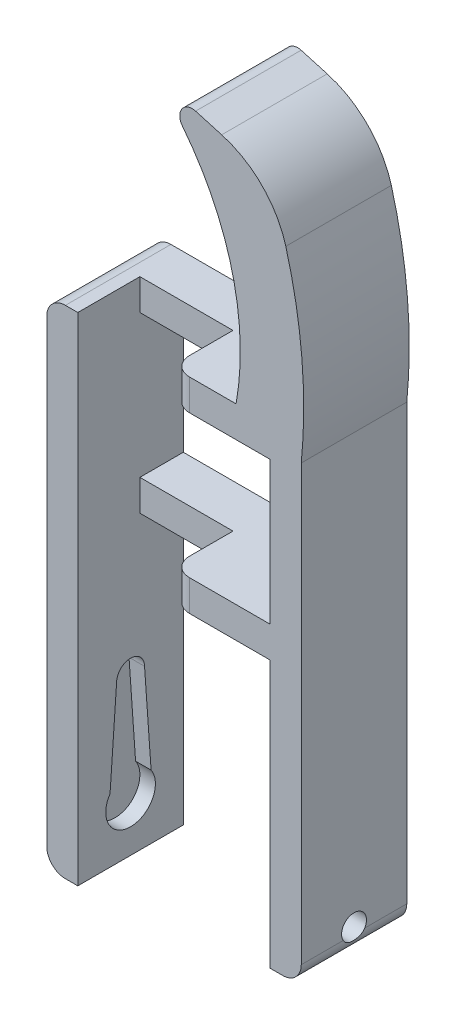
ISO-10303-21;
HEADER;
FILE_DESCRIPTION(('STEP AP214'),'2;1');
FILE_NAME('part.step','',(''),(''),'','','');
FILE_SCHEMA(('AUTOMOTIVE_DESIGN { 1 0 10303 214 1 1 1 1 }'));
ENDSEC;
DATA;
#1=APPLICATION_CONTEXT('core data for automotive mechanical design processes');
#2=APPLICATION_PROTOCOL_DEFINITION('international standard','automotive_design',2000,#1);
#3=PRODUCT_CONTEXT('',#1,'mechanical');
#4=PRODUCT('Part','Part','',(#3));
#5=PRODUCT_RELATED_PRODUCT_CATEGORY('part','',(#4));
#6=PRODUCT_DEFINITION_FORMATION('','',#4);
#7=PRODUCT_DEFINITION_CONTEXT('part definition',#1,'design');
#8=PRODUCT_DEFINITION('design','',#6,#7);
#9=PRODUCT_DEFINITION_SHAPE('','',#8);
#10=(LENGTH_UNIT() NAMED_UNIT(*) SI_UNIT(.MILLI.,.METRE.));
#11=(NAMED_UNIT(*) PLANE_ANGLE_UNIT() SI_UNIT($,.RADIAN.));
#12=(NAMED_UNIT(*) SI_UNIT($,.STERADIAN.) SOLID_ANGLE_UNIT());
#13=UNCERTAINTY_MEASURE_WITH_UNIT(LENGTH_MEASURE(1.E-05),#10,'distance_accuracy_value','');
#14=(GEOMETRIC_REPRESENTATION_CONTEXT(3) GLOBAL_UNCERTAINTY_ASSIGNED_CONTEXT((#13)) GLOBAL_UNIT_ASSIGNED_CONTEXT((#10,
#11,#12)) REPRESENTATION_CONTEXT('',''));
#15=CARTESIAN_POINT('',(0.,0.,0.));
#16=DIRECTION('',(0.,0.,1.));
#17=DIRECTION('',(1.,0.,0.));
#18=AXIS2_PLACEMENT_3D('',#15,#16,#17);
#19=CARTESIAN_POINT('',(36.,80.,0.));
#20=DIRECTION('',(1.,0.,0.));
#21=DIRECTION('',(0.,0.,-1.));
#22=AXIS2_PLACEMENT_3D('',#19,#20,#21);
#23=PLANE('',#22);
#24=CARTESIAN_POINT('',(36.,8.,8.5));
#25=DIRECTION('',(1.,0.,0.));
#26=DIRECTION('',(0.,0.,-1.));
#27=AXIS2_PLACEMENT_3D('',#24,#25,#26);
#28=CIRCLE('',#27,2.);
#29=CARTESIAN_POINT('',(36.,8.,6.5));
#30=VERTEX_POINT('',#29);
#31=EDGE_CURVE('E509',#30,#30,#28,.F.);
#32=ORIENTED_EDGE('',*,*,#31,.F.);
#33=EDGE_LOOP('',(#32));
#34=FACE_BOUND('',#33,.T.);
#35=DIRECTION('',(0.,-1.,0.));
#36=VECTOR('',#35,1.);
#37=CARTESIAN_POINT('',(36.,80.,17.));
#38=LINE('',#37,#36);
#39=CARTESIAN_POINT('',(36.,47.,17.));
#40=VERTEX_POINT('',#39);
#41=CARTESIAN_POINT('',(36.,4.,17.));
#42=VERTEX_POINT('',#41);
#43=EDGE_CURVE('E531',#40,#42,#38,.T.);
#44=ORIENTED_EDGE('',*,*,#43,.F.);
#45=DIRECTION('',(0.,0.,-1.));
#46=VECTOR('',#45,1.);
#47=CARTESIAN_POINT('',(36.,47.,7.));
#48=LINE('',#47,#46);
#49=CARTESIAN_POINT('',(36.,47.,0.));
#50=VERTEX_POINT('',#49);
#51=EDGE_CURVE('E495',#40,#50,#48,.T.);
#52=ORIENTED_EDGE('',*,*,#51,.T.);
#53=DIRECTION('',(0.,-1.,0.));
#54=VECTOR('',#53,1.);
#55=CARTESIAN_POINT('',(36.,80.,0.));
#56=LINE('',#55,#54);
#57=CARTESIAN_POINT('',(36.,4.,0.));
#58=VERTEX_POINT('',#57);
#59=EDGE_CURVE('E522',#50,#58,#56,.T.);
#60=ORIENTED_EDGE('',*,*,#59,.T.);
#61=DIRECTION('',(0.,0.,-1.));
#62=VECTOR('',#61,1.);
#63=CARTESIAN_POINT('',(36.,4.,17.));
#64=LINE('',#63,#62);
#65=EDGE_CURVE('E512',#42,#58,#64,.T.);
#66=ORIENTED_EDGE('',*,*,#65,.F.);
#67=EDGE_LOOP('',(#44,#52,#60,#66));
#68=FACE_BOUND('',#67,.T.);
#69=ADVANCED_FACE('F37',(#34,#68),#23,.F.);
#70=DIRECTION('',(0.,0.,1.));
#71=VECTOR('',#70,1.);
#72=CARTESIAN_POINT('',(36.,52.,7.));
#73=LINE('',#72,#71);
#74=CARTESIAN_POINT('',(36.,52.,0.));
#75=VERTEX_POINT('',#74);
#76=CARTESIAN_POINT('',(36.,52.,17.));
#77=VERTEX_POINT('',#76);
#78=EDGE_CURVE('E502',#75,#77,#73,.T.);
#79=ORIENTED_EDGE('',*,*,#78,.T.);
#80=CARTESIAN_POINT('',(36.,75.,17.));
#81=VERTEX_POINT('',#80);
#82=EDGE_CURVE('E532',#81,#77,#38,.T.);
#83=ORIENTED_EDGE('',*,*,#82,.F.);
#84=DIRECTION('',(0.,0.,-1.));
#85=VECTOR('',#84,1.);
#86=CARTESIAN_POINT('',(36.,75.,7.));
#87=LINE('',#86,#85);
#88=CARTESIAN_POINT('',(36.,75.,0.));
#89=VERTEX_POINT('',#88);
#90=EDGE_CURVE('E544',#81,#89,#87,.T.);
#91=ORIENTED_EDGE('',*,*,#90,.T.);
#92=EDGE_CURVE('E523',#89,#75,#56,.T.);
#93=ORIENTED_EDGE('',*,*,#92,.T.);
#94=EDGE_LOOP('',(#79,#83,#91,#93));
#95=FACE_BOUND('',#94,.T.);
#96=ADVANCED_FACE('F387',(#95),#23,.F.);
#97=CARTESIAN_POINT('',(41.002,52.,7.));
#98=DIRECTION('',(0.,0.,-1.));
#99=DIRECTION('',(-1.,0.,0.));
#100=AXIS2_PLACEMENT_3D('',#97,#98,#99);
#101=PLANE('',#100);
#102=DIRECTION('',(0.,-1.,0.));
#103=VECTOR('',#102,1.);
#104=CARTESIAN_POINT('',(20.,47.,6.99999999999996));
#105=LINE('',#104,#103);
#106=CARTESIAN_POINT('',(20.,52.,6.99999999999996));
#107=VERTEX_POINT('',#106);
#108=CARTESIAN_POINT('',(20.,47.,7.));
#109=VERTEX_POINT('',#108);
#110=EDGE_CURVE('E266',#107,#109,#105,.T.);
#111=ORIENTED_EDGE('',*,*,#110,.F.);
#112=DIRECTION('',(-1.,0.,0.));
#113=VECTOR('',#112,1.);
#114=CARTESIAN_POINT('',(41.002,52.,7.));
#115=LINE('',#114,#113);
#116=CARTESIAN_POINT('',(5.,52.,7.));
#117=VERTEX_POINT('',#116);
#118=EDGE_CURVE('E492',#107,#117,#115,.T.);
#119=ORIENTED_EDGE('',*,*,#118,.T.);
#120=DIRECTION('',(0.,-1.,0.));
#121=VECTOR('',#120,1.);
#122=CARTESIAN_POINT('',(5.,52.,7.));
#123=LINE('',#122,#121);
#124=CARTESIAN_POINT('',(5.,47.,7.));
#125=VERTEX_POINT('',#124);
#126=EDGE_CURVE('E484',#117,#125,#123,.T.);
#127=ORIENTED_EDGE('',*,*,#126,.T.);
#128=DIRECTION('',(-1.,0.,0.));
#129=VECTOR('',#128,1.);
#130=CARTESIAN_POINT('',(41.002,47.,7.));
#131=LINE('',#130,#129);
#132=EDGE_CURVE('E493',#109,#125,#131,.T.);
#133=ORIENTED_EDGE('',*,*,#132,.F.);
#134=EDGE_LOOP('',(#111,#119,#127,#133));
#135=FACE_BOUND('',#134,.T.);
#136=ADVANCED_FACE('F372',(#135),#101,.F.);
#137=CARTESIAN_POINT('',(41.002,80.,7.));
#138=DIRECTION('',(0.,0.,-1.));
#139=DIRECTION('',(0.,1.,0.));
#140=AXIS2_PLACEMENT_3D('',#137,#138,#139);
#141=PLANE('',#140);
#142=DIRECTION('',(0.,-1.,0.));
#143=VECTOR('',#142,1.);
#144=CARTESIAN_POINT('',(20.,80.,6.99999999999996));
#145=LINE('',#144,#143);
#146=CARTESIAN_POINT('',(20.,80.,6.99999999999996));
#147=VERTEX_POINT('',#146);
#148=CARTESIAN_POINT('',(20.,75.,6.99999999999996));
#149=VERTEX_POINT('',#148);
#150=EDGE_CURVE('E477',#147,#149,#145,.T.);
#151=ORIENTED_EDGE('',*,*,#150,.F.);
#152=DIRECTION('',(-1.,0.,0.));
#153=VECTOR('',#152,1.);
#154=CARTESIAN_POINT('',(41.002,80.,7.));
#155=LINE('',#154,#153);
#156=CARTESIAN_POINT('',(5.,80.,7.));
#157=VERTEX_POINT('',#156);
#158=EDGE_CURVE('E539',#147,#157,#155,.T.);
#159=ORIENTED_EDGE('',*,*,#158,.T.);
#160=DIRECTION('',(0.,-1.,0.));
#161=VECTOR('',#160,1.);
#162=CARTESIAN_POINT('',(5.,80.,7.));
#163=LINE('',#162,#161);
#164=CARTESIAN_POINT('',(5.,75.,7.));
#165=VERTEX_POINT('',#164);
#166=EDGE_CURVE('E535',#157,#165,#163,.T.);
#167=ORIENTED_EDGE('',*,*,#166,.T.);
#168=DIRECTION('',(-1.,0.,0.));
#169=VECTOR('',#168,1.);
#170=CARTESIAN_POINT('',(41.002,75.,7.));
#171=LINE('',#170,#169);
#172=EDGE_CURVE('E542',#149,#165,#171,.T.);
#173=ORIENTED_EDGE('',*,*,#172,.F.);
#174=EDGE_LOOP('',(#151,#159,#167,#173));
#175=FACE_BOUND('',#174,.T.);
#176=ADVANCED_FACE('F393',(#175),#141,.F.);
#177=CARTESIAN_POINT('',(5.,80.,0.));
#178=DIRECTION('',(-1.,0.,0.));
#179=DIRECTION('',(0.,0.,1.));
#180=AXIS2_PLACEMENT_3D('',#177,#178,#179);
#181=PLANE('',#180);
#182=CARTESIAN_POINT('',(5.,25.2677997154365,8.5));
#183=DIRECTION('',(1.,0.,0.));
#184=DIRECTION('',(0.,0.,-1.));
#185=AXIS2_PLACEMENT_3D('',#182,#183,#184);
#186=CIRCLE('',#185,2.25);
#187=CARTESIAN_POINT('',(5.,25.2677997154365,10.75));
#188=VERTEX_POINT('',#187);
#189=CARTESIAN_POINT('',(5.,25.2677997154365,6.25));
#190=VERTEX_POINT('',#189);
#191=EDGE_CURVE('E551',#188,#190,#186,.F.);
#192=ORIENTED_EDGE('',*,*,#191,.T.);
#193=DIRECTION('',(0.,0.997531391051944,0.0702219614221419));
#194=VECTOR('',#193,1.);
#195=CARTESIAN_POINT('',(5.,-0.313205167656498,4.44920620628706));
#196=LINE('',#195,#194);
#197=CARTESIAN_POINT('',(5.,10.25,5.19281086116926));
#198=VERTEX_POINT('',#197);
#199=EDGE_CURVE('E555',#198,#190,#196,.T.);
#200=ORIENTED_EDGE('',*,*,#199,.F.);
#201=CARTESIAN_POINT('',(5.,8.,8.5));
#202=DIRECTION('',(1.,0.,0.));
#203=DIRECTION('',(0.,0.,-1.));
#204=AXIS2_PLACEMENT_3D('',#201,#202,#203);
#205=CIRCLE('',#204,4.);
#206=CARTESIAN_POINT('',(5.,10.25,11.8071891388307));
#207=VERTEX_POINT('',#206);
#208=EDGE_CURVE('E569',#207,#198,#205,.T.);
#209=ORIENTED_EDGE('',*,*,#208,.F.);
#210=DIRECTION('',(0.,0.997531391051944,-0.0702219614221418));
#211=VECTOR('',#210,1.);
#212=CARTESIAN_POINT('',(5.,0.877621216960529,12.4669646879914));
#213=LINE('',#212,#211);
#214=EDGE_CURVE('E566',#207,#188,#213,.T.);
#215=ORIENTED_EDGE('',*,*,#214,.T.);
#216=EDGE_LOOP('',(#192,#200,#209,#215));
#217=FACE_BOUND('',#216,.T.);
#218=DIRECTION('',(0.,0.,-1.));
#219=VECTOR('',#218,1.);
#220=CARTESIAN_POINT('',(5.,47.,7.));
#221=LINE('',#220,#219);
#222=CARTESIAN_POINT('',(5.,47.,0.));
#223=VERTEX_POINT('',#222);
#224=EDGE_CURVE('E485',#125,#223,#221,.T.);
#225=ORIENTED_EDGE('',*,*,#224,.F.);
#226=ORIENTED_EDGE('',*,*,#126,.F.);
#227=DIRECTION('',(0.,0.,1.));
#228=VECTOR('',#227,1.);
#229=CARTESIAN_POINT('',(5.,52.,7.));
#230=LINE('',#229,#228);
#231=CARTESIAN_POINT('',(5.,52.,0.));
#232=VERTEX_POINT('',#231);
#233=EDGE_CURVE('E487',#232,#117,#230,.T.);
#234=ORIENTED_EDGE('',*,*,#233,.F.);
#235=DIRECTION('',(0.,-1.,0.));
#236=VECTOR('',#235,1.);
#237=CARTESIAN_POINT('',(5.,80.,0.));
#238=LINE('',#237,#236);
#239=CARTESIAN_POINT('',(5.,75.,0.));
#240=VERTEX_POINT('',#239);
#241=EDGE_CURVE('E294',#240,#232,#238,.T.);
#242=ORIENTED_EDGE('',*,*,#241,.F.);
#243=DIRECTION('',(0.,0.,-1.));
#244=VECTOR('',#243,1.);
#245=CARTESIAN_POINT('',(5.,75.,7.));
#246=LINE('',#245,#244);
#247=EDGE_CURVE('E536',#165,#240,#246,.T.);
#248=ORIENTED_EDGE('',*,*,#247,.F.);
#249=ORIENTED_EDGE('',*,*,#166,.F.);
#250=DIRECTION('',(0.,0.,-1.));
#251=VECTOR('',#250,1.);
#252=CARTESIAN_POINT('',(5.,80.,0.));
#253=LINE('',#252,#251);
#254=CARTESIAN_POINT('',(5.,80.,17.));
#255=VERTEX_POINT('',#254);
#256=EDGE_CURVE('E275',#255,#157,#253,.T.);
#257=ORIENTED_EDGE('',*,*,#256,.F.);
#258=DIRECTION('',(0.,-1.,0.));
#259=VECTOR('',#258,1.);
#260=CARTESIAN_POINT('',(5.,80.,17.));
#261=LINE('',#260,#259);
#262=CARTESIAN_POINT('',(5.,0.,17.));
#263=VERTEX_POINT('',#262);
#264=EDGE_CURVE('E297',#255,#263,#261,.T.);
#265=ORIENTED_EDGE('',*,*,#264,.T.);
#266=DIRECTION('',(0.,0.,-1.));
#267=VECTOR('',#266,1.);
#268=CARTESIAN_POINT('',(5.,0.,0.));
#269=LINE('',#268,#267);
#270=CARTESIAN_POINT('',(5.,0.,0.));
#271=VERTEX_POINT('',#270);
#272=EDGE_CURVE('E287',#263,#271,#269,.T.);
#273=ORIENTED_EDGE('',*,*,#272,.T.);
#274=EDGE_CURVE('E278',#223,#271,#238,.T.);
#275=ORIENTED_EDGE('',*,*,#274,.F.);
#276=EDGE_LOOP('',(#225,#226,#234,#242,#248,#249,#257,#265,#273,#275));
#277=FACE_BOUND('',#276,.T.);
#278=ADVANCED_FACE('F396',(#217,#277),#181,.F.);
#279=CARTESIAN_POINT('',(0.,80.,0.));
#280=DIRECTION('',(1.,0.,0.));
#281=DIRECTION('',(0.,0.,-1.));
#282=AXIS2_PLACEMENT_3D('',#279,#280,#281);
#283=PLANE('',#282);
#284=DIRECTION('',(0.,-1.,0.));
#285=VECTOR('',#284,1.);
#286=CARTESIAN_POINT('',(0.,80.,17.));
#287=LINE('',#286,#285);
#288=CARTESIAN_POINT('',(0.,77.,17.));
#289=VERTEX_POINT('',#288);
#290=CARTESIAN_POINT('',(0.,3.,17.));
#291=VERTEX_POINT('',#290);
#292=EDGE_CURVE('E300',#289,#291,#287,.T.);
#293=ORIENTED_EDGE('',*,*,#292,.F.);
#294=DIRECTION('',(0.,0.,1.));
#295=VECTOR('',#294,1.);
#296=CARTESIAN_POINT('',(0.,77.,0.));
#297=LINE('',#296,#295);
#298=CARTESIAN_POINT('',(0.,77.,0.));
#299=VERTEX_POINT('',#298);
#300=EDGE_CURVE('E332',#289,#299,#297,.F.);
#301=ORIENTED_EDGE('',*,*,#300,.T.);
#302=DIRECTION('',(0.,-1.,0.));
#303=VECTOR('',#302,1.);
#304=CARTESIAN_POINT('',(0.,80.,0.));
#305=LINE('',#304,#303);
#306=CARTESIAN_POINT('',(0.,3.,0.));
#307=VERTEX_POINT('',#306);
#308=EDGE_CURVE('E274',#299,#307,#305,.T.);
#309=ORIENTED_EDGE('',*,*,#308,.T.);
#310=DIRECTION('',(0.,0.,1.));
#311=VECTOR('',#310,1.);
#312=CARTESIAN_POINT('',(0.,3.,0.));
#313=LINE('',#312,#311);
#314=EDGE_CURVE('E329',#307,#291,#313,.T.);
#315=ORIENTED_EDGE('',*,*,#314,.T.);
#316=EDGE_LOOP('',(#293,#301,#309,#315));
#317=FACE_BOUND('',#316,.T.);
#318=ADVANCED_FACE('F429',(#317),#283,.F.);
#319=CARTESIAN_POINT('',(0.,80.,17.));
#320=DIRECTION('',(0.,0.,-1.));
#321=DIRECTION('',(-1.,0.,0.));
#322=AXIS2_PLACEMENT_3D('',#319,#320,#321);
#323=PLANE('',#322);
#324=DIRECTION('',(1.,0.,0.));
#325=VECTOR('',#324,1.);
#326=CARTESIAN_POINT('',(0.,80.,17.));
#327=LINE('',#326,#325);
#328=CARTESIAN_POINT('',(3.,80.,17.));
#329=VERTEX_POINT('',#328);
#330=EDGE_CURVE('E281',#329,#255,#327,.T.);
#331=ORIENTED_EDGE('',*,*,#330,.F.);
#332=CARTESIAN_POINT('',(3.,77.,17.));
#333=DIRECTION('',(0.,0.,-1.));
#334=DIRECTION('',(-1.,0.,0.));
#335=AXIS2_PLACEMENT_3D('',#332,#333,#334);
#336=CIRCLE('',#335,3.);
#337=EDGE_CURVE('E327',#329,#289,#336,.F.);
#338=ORIENTED_EDGE('',*,*,#337,.T.);
#339=ORIENTED_EDGE('',*,*,#292,.T.);
#340=CARTESIAN_POINT('',(3.,3.,17.));
#341=DIRECTION('',(0.,0.,-1.));
#342=DIRECTION('',(-1.,0.,0.));
#343=AXIS2_PLACEMENT_3D('',#340,#341,#342);
#344=CIRCLE('',#343,3.);
#345=CARTESIAN_POINT('',(3.,0.,17.));
#346=VERTEX_POINT('',#345);
#347=EDGE_CURVE('E325',#291,#346,#344,.F.);
#348=ORIENTED_EDGE('',*,*,#347,.T.);
#349=DIRECTION('',(1.,0.,0.));
#350=VECTOR('',#349,1.);
#351=CARTESIAN_POINT('',(0.,0.,17.));
#352=LINE('',#351,#350);
#353=EDGE_CURVE('E285',#346,#263,#352,.T.);
#354=ORIENTED_EDGE('',*,*,#353,.T.);
#355=ORIENTED_EDGE('',*,*,#264,.F.);
#356=EDGE_LOOP('',(#331,#338,#339,#348,#354,#355));
#357=FACE_BOUND('',#356,.T.);
#358=ADVANCED_FACE('F425',(#357),#323,.F.);
#359=CARTESIAN_POINT('',(0.,80.,0.));
#360=DIRECTION('',(0.,0.,1.));
#361=DIRECTION('',(1.,0.,0.));
#362=AXIS2_PLACEMENT_3D('',#359,#360,#361);
#363=PLANE('',#362);
#364=ORIENTED_EDGE('',*,*,#241,.T.);
#365=DIRECTION('',(-1.,0.,0.));
#366=VECTOR('',#365,1.);
#367=CARTESIAN_POINT('',(41.002,52.,0.));
#368=LINE('',#367,#366);
#369=EDGE_CURVE('E499',#75,#232,#368,.T.);
#370=ORIENTED_EDGE('',*,*,#369,.F.);
#371=ORIENTED_EDGE('',*,*,#92,.F.);
#372=DIRECTION('',(-1.,0.,0.));
#373=VECTOR('',#372,1.);
#374=CARTESIAN_POINT('',(41.002,75.,0.));
#375=LINE('',#374,#373);
#376=EDGE_CURVE('E545',#89,#240,#375,.T.);
#377=ORIENTED_EDGE('',*,*,#376,.T.);
#378=EDGE_LOOP('',(#364,#370,#371,#377));
#379=FACE_BOUND('',#378,.T.);
#380=DIRECTION('',(-0.961523947640823,0.274721127897379,0.));
#381=VECTOR('',#380,1.);
#382=CARTESIAN_POINT('',(17.0712082897131,119.558177774716,0.));
#383=LINE('',#382,#381);
#384=CARTESIAN_POINT('',(28.1803762196112,116.384129794745,0.));
#385=VERTEX_POINT('',#384);
#386=CARTESIAN_POINT('',(23.9787472792206,117.584595206285,0.));
#387=VERTEX_POINT('',#386);
#388=EDGE_CURVE('E267',#385,#387,#383,.T.);
#389=ORIENTED_EDGE('',*,*,#388,.F.);
#390=CARTESIAN_POINT('',(24.0595593011505,101.961270580133,0.));
#391=DIRECTION('',(0.,0.,1.));
#392=DIRECTION('',(1.,0.,0.));
#393=AXIS2_PLACEMENT_3D('',#390,#391,#392);
#394=CIRCLE('',#393,15.);
#395=CARTESIAN_POINT('',(38.5085143162054,105.989632402626,0.));
#396=VERTEX_POINT('',#395);
#397=EDGE_CURVE('E11',#385,#396,#394,.F.);
#398=ORIENTED_EDGE('',*,*,#397,.T.);
#399=CARTESIAN_POINT('',(-37.2055834888464,84.8805777544116,0.));
#400=DIRECTION('',(0.,0.,1.));
#401=DIRECTION('',(-1.,0.,0.));
#402=AXIS2_PLACEMENT_3D('',#399,#400,#401);
#403=CIRCLE('',#402,78.6016335362965);
#404=CARTESIAN_POINT('',(41.,77.,0.));
#405=VERTEX_POINT('',#404);
#406=EDGE_CURVE('E256',#405,#396,#403,.T.);
#407=ORIENTED_EDGE('',*,*,#406,.F.);
#408=DIRECTION('',(0.,-1.,0.));
#409=VECTOR('',#408,1.);
#410=CARTESIAN_POINT('',(41.,80.,0.));
#411=LINE('',#410,#409);
#412=CARTESIAN_POINT('',(41.,7.00000000000001,0.));
#413=VERTEX_POINT('',#412);
#414=EDGE_CURVE('E525',#405,#413,#411,.T.);
#415=ORIENTED_EDGE('',*,*,#414,.T.);
#416=CARTESIAN_POINT('',(38.,7.,0.));
#417=DIRECTION('',(0.,0.,1.));
#418=DIRECTION('',(1.,0.,0.));
#419=AXIS2_PLACEMENT_3D('',#416,#417,#418);
#420=CIRCLE('',#419,3.);
#421=CARTESIAN_POINT('',(38.,4.,0.));
#422=VERTEX_POINT('',#421);
#423=EDGE_CURVE('E309',#413,#422,#420,.F.);
#424=ORIENTED_EDGE('',*,*,#423,.T.);
#425=DIRECTION('',(1.,0.,0.));
#426=VECTOR('',#425,1.);
#427=CARTESIAN_POINT('',(-0.001000000000001,4.,0.));
#428=LINE('',#427,#426);
#429=EDGE_CURVE('E515',#58,#422,#428,.T.);
#430=ORIENTED_EDGE('',*,*,#429,.F.);
#431=ORIENTED_EDGE('',*,*,#59,.F.);
#432=DIRECTION('',(-1.,0.,0.));
#433=VECTOR('',#432,1.);
#434=CARTESIAN_POINT('',(41.002,47.,0.));
#435=LINE('',#434,#433);
#436=EDGE_CURVE('E496',#50,#223,#435,.T.);
#437=ORIENTED_EDGE('',*,*,#436,.T.);
#438=ORIENTED_EDGE('',*,*,#274,.T.);
#439=DIRECTION('',(-1.,0.,0.));
#440=VECTOR('',#439,1.);
#441=CARTESIAN_POINT('',(0.,0.,0.));
#442=LINE('',#441,#440);
#443=CARTESIAN_POINT('',(3.,0.,0.));
#444=VERTEX_POINT('',#443);
#445=EDGE_CURVE('E291',#271,#444,#442,.T.);
#446=ORIENTED_EDGE('',*,*,#445,.T.);
#447=CARTESIAN_POINT('',(3.,3.,0.));
#448=DIRECTION('',(0.,0.,1.));
#449=DIRECTION('',(1.,0.,0.));
#450=AXIS2_PLACEMENT_3D('',#447,#448,#449);
#451=CIRCLE('',#450,3.);
#452=EDGE_CURVE('E307',#444,#307,#451,.F.);
#453=ORIENTED_EDGE('',*,*,#452,.T.);
#454=ORIENTED_EDGE('',*,*,#308,.F.);
#455=CARTESIAN_POINT('',(3.,77.,0.));
#456=DIRECTION('',(0.,0.,1.));
#457=DIRECTION('',(1.,0.,0.));
#458=AXIS2_PLACEMENT_3D('',#455,#456,#457);
#459=CIRCLE('',#458,3.);
#460=CARTESIAN_POINT('',(3.,80.,0.));
#461=VERTEX_POINT('',#460);
#462=EDGE_CURVE('E272',#299,#461,#459,.F.);
#463=ORIENTED_EDGE('',*,*,#462,.T.);
#464=DIRECTION('',(-1.,0.,0.));
#465=VECTOR('',#464,1.);
#466=CARTESIAN_POINT('',(0.,80.,0.));
#467=LINE('',#466,#465);
#468=CARTESIAN_POINT('',(30.5,80.,0.));
#469=VERTEX_POINT('',#468);
#470=EDGE_CURVE('E262',#469,#461,#467,.T.);
#471=ORIENTED_EDGE('',*,*,#470,.F.);
#472=CARTESIAN_POINT('',(-12.0394476855244,87.6175792804137,0.));
#473=DIRECTION('',(0.,0.,-1.));
#474=DIRECTION('',(-1.,0.,0.));
#475=AXIS2_PLACEMENT_3D('',#472,#473,#474);
#476=CIRCLE('',#475,43.2161095366399);
#477=CARTESIAN_POINT('',(21.8604503354652,114.4211058702,0.));
#478=VERTEX_POINT('',#477);
#479=EDGE_CURVE('E244',#478,#469,#476,.T.);
#480=ORIENTED_EDGE('',*,*,#479,.F.);
#481=CARTESIAN_POINT('',(23.4293050234259,115.661547311004,0.));
#482=DIRECTION('',(0.,0.,1.));
#483=DIRECTION('',(1.,0.,0.));
#484=AXIS2_PLACEMENT_3D('',#481,#482,#483);
#485=CIRCLE('',#484,2.);
#486=EDGE_CURVE('E630',#478,#387,#485,.F.);
#487=ORIENTED_EDGE('',*,*,#486,.T.);
#488=EDGE_LOOP('',(#389,#398,#407,#415,#424,#430,#431,#437,#438,#446,#453,#454,#463,#471,#480,#487));
#489=FACE_BOUND('',#488,.T.);
#490=ADVANCED_FACE('F269',(#379,#489),#363,.F.);
#491=CARTESIAN_POINT('',(0.,80.,0.));
#492=DIRECTION('',(0.,1.,0.));
#493=DIRECTION('',(0.,0.,1.));
#494=AXIS2_PLACEMENT_3D('',#491,#492,#493);
#495=PLANE('',#494);
#496=DIRECTION('',(0.,0.,1.));
#497=VECTOR('',#496,1.);
#498=CARTESIAN_POINT('',(30.5,80.,0.));
#499=LINE('',#498,#497);
#500=CARTESIAN_POINT('',(30.5,80.,17.));
#501=VERTEX_POINT('',#500);
#502=EDGE_CURVE('E248',#469,#501,#499,.T.);
#503=ORIENTED_EDGE('',*,*,#502,.F.);
#504=ORIENTED_EDGE('',*,*,#470,.T.);
#505=DIRECTION('',(0.,0.,1.));
#506=VECTOR('',#505,1.);
#507=CARTESIAN_POINT('',(3.,80.,17.));
#508=LINE('',#507,#506);
#509=EDGE_CURVE('E305',#461,#329,#508,.T.);
#510=ORIENTED_EDGE('',*,*,#509,.T.);
#511=ORIENTED_EDGE('',*,*,#330,.T.);
#512=ORIENTED_EDGE('',*,*,#256,.T.);
#513=ORIENTED_EDGE('',*,*,#158,.F.);
#514=DIRECTION('',(0.,0.,-1.));
#515=VECTOR('',#514,1.);
#516=CARTESIAN_POINT('',(20.,80.,17.));
#517=LINE('',#516,#515);
#518=CARTESIAN_POINT('',(20.,80.,14.));
#519=VERTEX_POINT('',#518);
#520=EDGE_CURVE('E475',#519,#147,#517,.T.);
#521=ORIENTED_EDGE('',*,*,#520,.F.);
#522=CARTESIAN_POINT('',(23.,80.,14.));
#523=DIRECTION('',(0.,1.,0.));
#524=DIRECTION('',(0.,0.,1.));
#525=AXIS2_PLACEMENT_3D('',#522,#523,#524);
#526=CIRCLE('',#525,3.);
#527=CARTESIAN_POINT('',(23.,80.,17.));
#528=VERTEX_POINT('',#527);
#529=EDGE_CURVE('E303',#519,#528,#526,.T.);
#530=ORIENTED_EDGE('',*,*,#529,.T.);
#531=DIRECTION('',(1.,0.,0.));
#532=VECTOR('',#531,1.);
#533=CARTESIAN_POINT('',(36.,80.,17.));
#534=LINE('',#533,#532);
#535=EDGE_CURVE('E265',#528,#501,#534,.T.);
#536=ORIENTED_EDGE('',*,*,#535,.T.);
#537=EDGE_LOOP('',(#503,#504,#510,#511,#512,#513,#521,#530,#536));
#538=FACE_BOUND('',#537,.T.);
#539=ADVANCED_FACE('F260',(#538),#495,.T.);
#540=CARTESIAN_POINT('',(0.,0.,0.));
#541=DIRECTION('',(0.,1.,0.));
#542=DIRECTION('',(0.,0.,1.));
#543=AXIS2_PLACEMENT_3D('',#540,#541,#542);
#544=PLANE('',#543);
#545=ORIENTED_EDGE('',*,*,#353,.F.);
#546=DIRECTION('',(0.,0.,1.));
#547=VECTOR('',#546,1.);
#548=CARTESIAN_POINT('',(3.,0.,0.));
#549=LINE('',#548,#547);
#550=EDGE_CURVE('E357',#346,#444,#549,.F.);
#551=ORIENTED_EDGE('',*,*,#550,.T.);
#552=ORIENTED_EDGE('',*,*,#445,.F.);
#553=ORIENTED_EDGE('',*,*,#272,.F.);
#554=EDGE_LOOP('',(#545,#551,#552,#553));
#555=FACE_BOUND('',#554,.T.);
#556=ADVANCED_FACE('F416',(#555),#544,.F.);
#557=CARTESIAN_POINT('',(2.5,25.2677997154365,8.5));
#558=DIRECTION('',(1.,0.,0.));
#559=DIRECTION('',(0.,0.,-1.));
#560=AXIS2_PLACEMENT_3D('',#557,#558,#559);
#561=CYLINDRICAL_SURFACE('',#560,2.25);
#562=ORIENTED_EDGE('',*,*,#191,.F.);
#563=DIRECTION('',(1.,0.,0.));
#564=VECTOR('',#563,1.);
#565=CARTESIAN_POINT('',(2.5,25.2677997154365,10.75));
#566=LINE('',#565,#564);
#567=CARTESIAN_POINT('',(2.5,25.2677997154365,10.75));
#568=VERTEX_POINT('',#567);
#569=EDGE_CURVE('E563',#568,#188,#566,.T.);
#570=ORIENTED_EDGE('',*,*,#569,.F.);
#571=CARTESIAN_POINT('',(2.5,25.2677997154365,8.5));
#572=DIRECTION('',(1.,0.,0.));
#573=DIRECTION('',(0.,0.,-1.));
#574=AXIS2_PLACEMENT_3D('',#571,#572,#573);
#575=CIRCLE('',#574,2.25);
#576=CARTESIAN_POINT('',(2.5,25.2677997154365,6.25));
#577=VERTEX_POINT('',#576);
#578=EDGE_CURVE('E552',#568,#577,#575,.F.);
#579=ORIENTED_EDGE('',*,*,#578,.T.);
#580=DIRECTION('',(1.,0.,0.));
#581=VECTOR('',#580,1.);
#582=CARTESIAN_POINT('',(2.5,25.2677997154365,6.25));
#583=LINE('',#582,#581);
#584=EDGE_CURVE('E288',#577,#190,#583,.T.);
#585=ORIENTED_EDGE('',*,*,#584,.T.);
#586=EDGE_LOOP('',(#562,#570,#579,#585));
#587=FACE_BOUND('',#586,.T.);
#588=ADVANCED_FACE('F406',(#587),#561,.F.);
#589=CARTESIAN_POINT('',(2.5,-0.313205167656498,4.44920620628706));
#590=DIRECTION('',(0.,0.0702219614221419,-0.997531391051944));
#591=DIRECTION('',(0.,0.997531391051944,0.0702219614221419));
#592=AXIS2_PLACEMENT_3D('',#589,#590,#591);
#593=PLANE('',#592);
#594=ORIENTED_EDGE('',*,*,#199,.T.);
#595=ORIENTED_EDGE('',*,*,#584,.F.);
#596=DIRECTION('',(0.,0.997531391051944,0.0702219614221419));
#597=VECTOR('',#596,1.);
#598=CARTESIAN_POINT('',(2.5,-0.313205167656498,4.44920620628706));
#599=LINE('',#598,#597);
#600=CARTESIAN_POINT('',(2.5,10.25,5.19281086116926));
#601=VERTEX_POINT('',#600);
#602=EDGE_CURVE('E560',#601,#577,#599,.T.);
#603=ORIENTED_EDGE('',*,*,#602,.F.);
#604=DIRECTION('',(1.,0.,0.));
#605=VECTOR('',#604,1.);
#606=CARTESIAN_POINT('',(2.5,10.25,5.19281086116926));
#607=LINE('',#606,#605);
#608=EDGE_CURVE('E575',#601,#198,#607,.T.);
#609=ORIENTED_EDGE('',*,*,#608,.T.);
#610=EDGE_LOOP('',(#594,#595,#603,#609));
#611=FACE_BOUND('',#610,.T.);
#612=ADVANCED_FACE('F402',(#611),#593,.F.);
#613=CARTESIAN_POINT('',(2.5,8.,8.5));
#614=DIRECTION('',(1.,0.,0.));
#615=DIRECTION('',(0.,0.,-1.));
#616=AXIS2_PLACEMENT_3D('',#613,#614,#615);
#617=CYLINDRICAL_SURFACE('',#616,4.);
#618=ORIENTED_EDGE('',*,*,#208,.T.);
#619=ORIENTED_EDGE('',*,*,#608,.F.);
#620=CARTESIAN_POINT('',(2.5,8.,8.5));
#621=DIRECTION('',(1.,0.,0.));
#622=DIRECTION('',(0.,0.,-1.));
#623=AXIS2_PLACEMENT_3D('',#620,#621,#622);
#624=CIRCLE('',#623,4.);
#625=CARTESIAN_POINT('',(2.5,10.25,11.8071891388307));
#626=VERTEX_POINT('',#625);
#627=EDGE_CURVE('E557',#626,#601,#624,.T.);
#628=ORIENTED_EDGE('',*,*,#627,.F.);
#629=DIRECTION('',(1.,0.,0.));
#630=VECTOR('',#629,1.);
#631=CARTESIAN_POINT('',(2.5,10.25,11.8071891388307));
#632=LINE('',#631,#630);
#633=EDGE_CURVE('E577',#626,#207,#632,.T.);
#634=ORIENTED_EDGE('',*,*,#633,.T.);
#635=EDGE_LOOP('',(#618,#619,#628,#634));
#636=FACE_BOUND('',#635,.T.);
#637=ADVANCED_FACE('F405',(#636),#617,.F.);
#638=CARTESIAN_POINT('',(2.5,0.877621216960529,12.4669646879914));
#639=DIRECTION('',(0.,-0.0702219614221418,-0.997531391051944));
#640=DIRECTION('',(0.,0.997531391051944,-0.0702219614221418));
#641=AXIS2_PLACEMENT_3D('',#638,#639,#640);
#642=PLANE('',#641);
#643=ORIENTED_EDGE('',*,*,#214,.F.);
#644=ORIENTED_EDGE('',*,*,#633,.F.);
#645=DIRECTION('',(0.,0.997531391051944,-0.0702219614221418));
#646=VECTOR('',#645,1.);
#647=CARTESIAN_POINT('',(2.5,0.877621216960529,12.4669646879914));
#648=LINE('',#647,#646);
#649=EDGE_CURVE('E554',#626,#568,#648,.T.);
#650=ORIENTED_EDGE('',*,*,#649,.T.);
#651=ORIENTED_EDGE('',*,*,#569,.T.);
#652=EDGE_LOOP('',(#643,#644,#650,#651));
#653=FACE_BOUND('',#652,.T.);
#654=ADVANCED_FACE('F400',(#653),#642,.T.);
#655=CARTESIAN_POINT('',(2.5,0.,0.));
#656=DIRECTION('',(1.,0.,0.));
#657=DIRECTION('',(0.,0.,-1.));
#658=AXIS2_PLACEMENT_3D('',#655,#656,#657);
#659=PLANE('',#658);
#660=ORIENTED_EDGE('',*,*,#578,.F.);
#661=ORIENTED_EDGE('',*,*,#649,.F.);
#662=ORIENTED_EDGE('',*,*,#627,.T.);
#663=ORIENTED_EDGE('',*,*,#602,.T.);
#664=EDGE_LOOP('',(#660,#661,#662,#663));
#665=FACE_BOUND('',#664,.T.);
#666=ADVANCED_FACE('F391',(#665),#659,.T.);
#667=CARTESIAN_POINT('',(41.002,75.,7.));
#668=DIRECTION('',(0.,1.,0.));
#669=DIRECTION('',(0.,0.,1.));
#670=AXIS2_PLACEMENT_3D('',#667,#668,#669);
#671=PLANE('',#670);
#672=DIRECTION('',(1.,0.,0.));
#673=VECTOR('',#672,1.);
#674=CARTESIAN_POINT('',(20.,75.,17.));
#675=LINE('',#674,#673);
#676=CARTESIAN_POINT('',(23.,75.,17.));
#677=VERTEX_POINT('',#676);
#678=EDGE_CURVE('E482',#677,#81,#675,.T.);
#679=ORIENTED_EDGE('',*,*,#678,.F.);
#680=CARTESIAN_POINT('',(23.,75.,14.));
#681=DIRECTION('',(0.,1.,0.));
#682=DIRECTION('',(0.,0.,1.));
#683=AXIS2_PLACEMENT_3D('',#680,#681,#682);
#684=CIRCLE('',#683,3.);
#685=CARTESIAN_POINT('',(20.,75.,14.));
#686=VERTEX_POINT('',#685);
#687=EDGE_CURVE('E337',#677,#686,#684,.F.);
#688=ORIENTED_EDGE('',*,*,#687,.T.);
#689=DIRECTION('',(0.,0.,1.));
#690=VECTOR('',#689,1.);
#691=CARTESIAN_POINT('',(20.,75.,17.));
#692=LINE('',#691,#690);
#693=EDGE_CURVE('E479',#149,#686,#692,.T.);
#694=ORIENTED_EDGE('',*,*,#693,.F.);
#695=ORIENTED_EDGE('',*,*,#172,.T.);
#696=ORIENTED_EDGE('',*,*,#247,.T.);
#697=ORIENTED_EDGE('',*,*,#376,.F.);
#698=ORIENTED_EDGE('',*,*,#90,.F.);
#699=EDGE_LOOP('',(#679,#688,#694,#695,#696,#697,#698));
#700=FACE_BOUND('',#699,.T.);
#701=ADVANCED_FACE('F384',(#700),#671,.F.);
#702=CARTESIAN_POINT('',(36.,80.,17.));
#703=DIRECTION('',(0.,0.,-1.));
#704=DIRECTION('',(-1.,0.,0.));
#705=AXIS2_PLACEMENT_3D('',#702,#703,#704);
#706=PLANE('',#705);
#707=CARTESIAN_POINT('',(-37.2055834888464,84.8805777544116,17.));
#708=DIRECTION('',(0.,0.,1.));
#709=DIRECTION('',(-1.,0.,0.));
#710=AXIS2_PLACEMENT_3D('',#707,#708,#709);
#711=CIRCLE('',#710,78.6016335362965);
#712=CARTESIAN_POINT('',(41.,77.,17.));
#713=VERTEX_POINT('',#712);
#714=CARTESIAN_POINT('',(38.5085143162054,105.989632402626,17.));
#715=VERTEX_POINT('',#714);
#716=EDGE_CURVE('E639',#713,#715,#711,.T.);
#717=ORIENTED_EDGE('',*,*,#716,.T.);
#718=CARTESIAN_POINT('',(24.0595593011505,101.961270580133,17.));
#719=DIRECTION('',(0.,0.,-1.));
#720=DIRECTION('',(-1.,0.,0.));
#721=AXIS2_PLACEMENT_3D('',#718,#719,#720);
#722=CIRCLE('',#721,15.);
#723=CARTESIAN_POINT('',(28.1803762196112,116.384129794745,17.));
#724=VERTEX_POINT('',#723);
#725=EDGE_CURVE('E59',#715,#724,#722,.F.);
#726=ORIENTED_EDGE('',*,*,#725,.T.);
#727=DIRECTION('',(-0.961523947640823,0.274721127897379,0.));
#728=VECTOR('',#727,1.);
#729=CARTESIAN_POINT('',(17.0712082897131,119.558177774716,17.));
#730=LINE('',#729,#728);
#731=CARTESIAN_POINT('',(23.9787472792206,117.584595206285,17.));
#732=VERTEX_POINT('',#731);
#733=EDGE_CURVE('E257',#724,#732,#730,.T.);
#734=ORIENTED_EDGE('',*,*,#733,.T.);
#735=CARTESIAN_POINT('',(23.4293050234259,115.661547311004,17.));
#736=DIRECTION('',(0.,0.,-1.));
#737=DIRECTION('',(-1.,0.,0.));
#738=AXIS2_PLACEMENT_3D('',#735,#736,#737);
#739=CIRCLE('',#738,2.);
#740=CARTESIAN_POINT('',(21.8604503354652,114.4211058702,17.));
#741=VERTEX_POINT('',#740);
#742=EDGE_CURVE('E625',#732,#741,#739,.F.);
#743=ORIENTED_EDGE('',*,*,#742,.T.);
#744=CARTESIAN_POINT('',(-12.0394476855244,87.6175792804137,17.));
#745=DIRECTION('',(0.,0.,-1.));
#746=DIRECTION('',(-1.,0.,0.));
#747=AXIS2_PLACEMENT_3D('',#744,#745,#746);
#748=CIRCLE('',#747,43.2161095366399);
#749=EDGE_CURVE('E644',#741,#501,#748,.T.);
#750=ORIENTED_EDGE('',*,*,#749,.T.);
#751=ORIENTED_EDGE('',*,*,#535,.F.);
#752=DIRECTION('',(0.,1.,0.));
#753=VECTOR('',#752,1.);
#754=CARTESIAN_POINT('',(23.,80.,17.));
#755=LINE('',#754,#753);
#756=EDGE_CURVE('E323',#528,#677,#755,.F.);
#757=ORIENTED_EDGE('',*,*,#756,.T.);
#758=ORIENTED_EDGE('',*,*,#678,.T.);
#759=ORIENTED_EDGE('',*,*,#82,.T.);
#760=DIRECTION('',(1.,0.,0.));
#761=VECTOR('',#760,1.);
#762=CARTESIAN_POINT('',(20.,52.,17.));
#763=LINE('',#762,#761);
#764=CARTESIAN_POINT('',(23.,52.,17.));
#765=VERTEX_POINT('',#764);
#766=EDGE_CURVE('E469',#765,#77,#763,.T.);
#767=ORIENTED_EDGE('',*,*,#766,.F.);
#768=DIRECTION('',(0.,1.,0.));
#769=VECTOR('',#768,1.);
#770=CARTESIAN_POINT('',(23.,80.,17.));
#771=LINE('',#770,#769);
#772=CARTESIAN_POINT('',(23.,47.,17.));
#773=VERTEX_POINT('',#772);
#774=EDGE_CURVE('E321',#765,#773,#771,.F.);
#775=ORIENTED_EDGE('',*,*,#774,.T.);
#776=DIRECTION('',(1.,0.,0.));
#777=VECTOR('',#776,1.);
#778=CARTESIAN_POINT('',(20.,47.,17.));
#779=LINE('',#778,#777);
#780=EDGE_CURVE('E463',#773,#40,#779,.T.);
#781=ORIENTED_EDGE('',*,*,#780,.T.);
#782=ORIENTED_EDGE('',*,*,#43,.T.);
#783=DIRECTION('',(1.,0.,0.));
#784=VECTOR('',#783,1.);
#785=CARTESIAN_POINT('',(-0.001000000000001,4.,17.));
#786=LINE('',#785,#784);
#787=CARTESIAN_POINT('',(38.,4.,17.));
#788=VERTEX_POINT('',#787);
#789=EDGE_CURVE('E516',#42,#788,#786,.T.);
#790=ORIENTED_EDGE('',*,*,#789,.T.);
#791=CARTESIAN_POINT('',(38.,7.,17.));
#792=DIRECTION('',(0.,0.,-1.));
#793=DIRECTION('',(-1.,0.,0.));
#794=AXIS2_PLACEMENT_3D('',#791,#792,#793);
#795=CIRCLE('',#794,3.);
#796=CARTESIAN_POINT('',(41.,7.00000000000001,17.));
#797=VERTEX_POINT('',#796);
#798=EDGE_CURVE('E319',#788,#797,#795,.F.);
#799=ORIENTED_EDGE('',*,*,#798,.T.);
#800=DIRECTION('',(0.,-1.,0.));
#801=VECTOR('',#800,1.);
#802=CARTESIAN_POINT('',(41.,80.,17.));
#803=LINE('',#802,#801);
#804=EDGE_CURVE('E528',#713,#797,#803,.T.);
#805=ORIENTED_EDGE('',*,*,#804,.F.);
#806=EDGE_LOOP('',(#717,#726,#734,#743,#750,#751,#757,#758,#759,#767,#775,#781,#782,#790,#799,#805));
#807=FACE_BOUND('',#806,.T.);
#808=ADVANCED_FACE('F380',(#807),#706,.F.);
#809=CARTESIAN_POINT('',(41.,80.,0.));
#810=DIRECTION('',(-1.,0.,0.));
#811=DIRECTION('',(0.,0.,1.));
#812=AXIS2_PLACEMENT_3D('',#809,#810,#811);
#813=PLANE('',#812);
#814=ORIENTED_EDGE('',*,*,#414,.F.);
#815=DIRECTION('',(0.,0.,-1.));
#816=VECTOR('',#815,1.);
#817=CARTESIAN_POINT('',(41.,77.,17.));
#818=LINE('',#817,#816);
#819=EDGE_CURVE('E316',#405,#713,#818,.F.);
#820=ORIENTED_EDGE('',*,*,#819,.T.);
#821=ORIENTED_EDGE('',*,*,#804,.T.);
#822=DIRECTION('',(0.,0.,1.));
#823=VECTOR('',#822,1.);
#824=CARTESIAN_POINT('',(41.,7.00000000000001,0.));
#825=LINE('',#824,#823);
#826=CARTESIAN_POINT('',(41.,7.00000000000001,10.2320508075689));
#827=VERTEX_POINT('',#826);
#828=EDGE_CURVE('E314',#797,#827,#825,.F.);
#829=ORIENTED_EDGE('',*,*,#828,.T.);
#830=CARTESIAN_POINT('',(41.,8.,8.5));
#831=DIRECTION('',(1.,0.,0.));
#832=DIRECTION('',(0.,0.,-1.));
#833=AXIS2_PLACEMENT_3D('',#830,#831,#832);
#834=CIRCLE('',#833,2.);
#835=CARTESIAN_POINT('',(41.,7.00000000000001,6.76794919243112));
#836=VERTEX_POINT('',#835);
#837=EDGE_CURVE('E505',#836,#827,#834,.T.);
#838=ORIENTED_EDGE('',*,*,#837,.F.);
#839=DIRECTION('',(0.,0.,1.));
#840=VECTOR('',#839,1.);
#841=CARTESIAN_POINT('',(41.,7.00000000000001,0.));
#842=LINE('',#841,#840);
#843=EDGE_CURVE('E312',#836,#413,#842,.F.);
#844=ORIENTED_EDGE('',*,*,#843,.T.);
#845=EDGE_LOOP('',(#814,#820,#821,#829,#838,#844));
#846=FACE_BOUND('',#845,.T.);
#847=ADVANCED_FACE('F376',(#846),#813,.F.);
#848=CARTESIAN_POINT('',(-0.001000000000001,4.,17.));
#849=DIRECTION('',(0.,1.,0.));
#850=DIRECTION('',(0.,0.,1.));
#851=AXIS2_PLACEMENT_3D('',#848,#849,#850);
#852=PLANE('',#851);
#853=ORIENTED_EDGE('',*,*,#429,.T.);
#854=DIRECTION('',(0.,0.,1.));
#855=VECTOR('',#854,1.);
#856=CARTESIAN_POINT('',(38.,4.,17.));
#857=LINE('',#856,#855);
#858=EDGE_CURVE('E346',#422,#788,#857,.T.);
#859=ORIENTED_EDGE('',*,*,#858,.T.);
#860=ORIENTED_EDGE('',*,*,#789,.F.);
#861=ORIENTED_EDGE('',*,*,#65,.T.);
#862=EDGE_LOOP('',(#853,#859,#860,#861));
#863=FACE_BOUND('',#862,.T.);
#864=ADVANCED_FACE('F369',(#863),#852,.F.);
#865=CARTESIAN_POINT('',(-0.001000000000001,8.,8.5));
#866=DIRECTION('',(1.,0.,0.));
#867=DIRECTION('',(0.,0.,-1.));
#868=AXIS2_PLACEMENT_3D('',#865,#866,#867);
#869=CYLINDRICAL_SURFACE('',#868,2.);
#870=ORIENTED_EDGE('',*,*,#837,.T.);
#871=CARTESIAN_POINT('',(41.,7.00000000000001,10.2320508075689));
#872=CARTESIAN_POINT('',(41.000003246879,6.95235045800706,10.2045433133446));
#873=CARTESIAN_POINT('',(40.9988644153685,6.90587386322937,10.1750842736607));
#874=CARTESIAN_POINT('',(40.9946667729227,6.81558726547454,10.112507643521));
#875=CARTESIAN_POINT('',(40.9916092356276,6.77177551471472,10.0793924920055));
#876=CARTESIAN_POINT('',(40.9801289054113,6.64502800510899,9.97511947796657));
#877=CARTESIAN_POINT('',(40.9693931901029,6.56643551431522,9.89883424058935));
#878=CARTESIAN_POINT('',(40.9449082719283,6.42310016051677,9.73500411774946));
#879=CARTESIAN_POINT('',(40.931164755528,6.35833161271303,9.64748060639631));
#880=CARTESIAN_POINT('',(40.9037178611149,6.24376106975268,9.46302309097961));
#881=CARTESIAN_POINT('',(40.8900145191842,6.19396989859045,9.36608234779401));
#882=CARTESIAN_POINT('',(40.8649728605559,6.1089370219198,9.16085018946276));
#883=CARTESIAN_POINT('',(40.8537573558681,6.07439053944809,9.0522536848689));
#884=CARTESIAN_POINT('',(40.8369950421372,6.02420547283364,8.83038267511844));
#885=CARTESIAN_POINT('',(40.8314447181504,6.00855516351522,8.71711111603586));
#886=CARTESIAN_POINT('',(40.827383235086,5.99703601779431,8.4943651607898));
#887=CARTESIAN_POINT('',(40.8285779698607,6.00034078256601,8.3849384595727));
#888=CARTESIAN_POINT('',(40.8370616133413,6.02468374596648,8.16832895672744));
#889=CARTESIAN_POINT('',(40.8443507106914,6.04572249353076,8.06114622466408));
#890=CARTESIAN_POINT('',(40.8632885845804,6.10418167688224,7.85406523869904));
#891=CARTESIAN_POINT('',(40.8748497797202,6.14127542552662,7.75406583030788));
#892=CARTESIAN_POINT('',(40.9000696496689,6.23074865604475,7.5613598184013));
#893=CARTESIAN_POINT('',(40.9137300934301,6.28314106331375,7.46865946607847));
#894=CARTESIAN_POINT('',(40.9411843484393,6.40537547348676,7.28765726907051));
#895=CARTESIAN_POINT('',(40.954941628559,6.47603986275372,7.19990469661778));
#896=CARTESIAN_POINT('',(40.9782920015662,6.63135783324346,7.03733361666782));
#897=CARTESIAN_POINT('',(40.9878945433787,6.71597906071087,6.96248599593491));
#898=CARTESIAN_POINT('',(40.9957496086829,6.83734755404398,6.87219738924607));
#899=CARTESIAN_POINT('',(40.9973143003361,6.86902802649775,6.85003003543885));
#900=CARTESIAN_POINT('',(40.9994389764101,6.93361405698785,6.80757289142435));
#901=CARTESIAN_POINT('',(40.9999998628735,6.96651848797169,6.78728143106495));
#902=CARTESIAN_POINT('',(41.,7.00000000000001,6.76794919243112));
#903=B_SPLINE_CURVE_WITH_KNOTS('',3,(#871,#872,#873,#874,#875,#876,#877,#878,#879,#880,#881,
#882,#883,#884,#885,#886,#887,#888,#889,#890,#891,#892,#893,#894,#895,#896,#897,#898,#899,#900,
#901,#902),.UNSPECIFIED.,.F.,.F.,(4,2,2,2,2,2,2,2,2,2,2,2,2,2,2,4),(0.,0.164928355044265,
0.329747346002017,0.658207068340202,0.986051097141593,1.31413148930953,1.65592666310572,
1.9975096420087,2.32431683994227,2.65113415419674,2.97159288998393,3.29232315937775,
3.63127871423117,3.96945929389357,4.08549092620193,4.20141823735251),.UNSPECIFIED.);
#904=EDGE_CURVE('E349',#827,#836,#903,.T.);
#905=ORIENTED_EDGE('',*,*,#904,.T.);
#906=EDGE_LOOP('',(#870,#905));
#907=FACE_BOUND('',#906,.T.);
#908=ORIENTED_EDGE('',*,*,#31,.T.);
#909=EDGE_LOOP('',(#908));
#910=FACE_BOUND('',#909,.T.);
#911=ADVANCED_FACE('F363',(#907,#910),#869,.F.);
#912=CARTESIAN_POINT('',(41.002,47.,7.));
#913=DIRECTION('',(0.,1.,0.));
#914=DIRECTION('',(0.,0.,1.));
#915=AXIS2_PLACEMENT_3D('',#912,#913,#914);
#916=PLANE('',#915);
#917=ORIENTED_EDGE('',*,*,#780,.F.);
#918=CARTESIAN_POINT('',(23.,47.,14.));
#919=DIRECTION('',(0.,1.,0.));
#920=DIRECTION('',(0.,0.,1.));
#921=AXIS2_PLACEMENT_3D('',#918,#919,#920);
#922=CIRCLE('',#921,3.);
#923=CARTESIAN_POINT('',(20.,47.,14.));
#924=VERTEX_POINT('',#923);
#925=EDGE_CURVE('E344',#773,#924,#922,.F.);
#926=ORIENTED_EDGE('',*,*,#925,.T.);
#927=DIRECTION('',(0.,0.,1.));
#928=VECTOR('',#927,1.);
#929=CARTESIAN_POINT('',(20.,47.,6.99999999999996));
#930=LINE('',#929,#928);
#931=EDGE_CURVE('E460',#109,#924,#930,.T.);
#932=ORIENTED_EDGE('',*,*,#931,.F.);
#933=ORIENTED_EDGE('',*,*,#132,.T.);
#934=ORIENTED_EDGE('',*,*,#224,.T.);
#935=ORIENTED_EDGE('',*,*,#436,.F.);
#936=ORIENTED_EDGE('',*,*,#51,.F.);
#937=EDGE_LOOP('',(#917,#926,#932,#933,#934,#935,#936));
#938=FACE_BOUND('',#937,.T.);
#939=ADVANCED_FACE('F368',(#938),#916,.F.);
#940=CARTESIAN_POINT('',(41.002,52.,7.));
#941=DIRECTION('',(0.,-1.,0.));
#942=DIRECTION('',(0.,0.,-1.));
#943=AXIS2_PLACEMENT_3D('',#940,#941,#942);
#944=PLANE('',#943);
#945=DIRECTION('',(0.,0.,-1.));
#946=VECTOR('',#945,1.);
#947=CARTESIAN_POINT('',(20.,52.,6.99999999999996));
#948=LINE('',#947,#946);
#949=CARTESIAN_POINT('',(20.,52.,14.));
#950=VERTEX_POINT('',#949);
#951=EDGE_CURVE('E467',#950,#107,#948,.T.);
#952=ORIENTED_EDGE('',*,*,#951,.F.);
#953=CARTESIAN_POINT('',(23.,52.,14.));
#954=DIRECTION('',(0.,-1.,0.));
#955=DIRECTION('',(0.,0.,-1.));
#956=AXIS2_PLACEMENT_3D('',#953,#954,#955);
#957=CIRCLE('',#956,3.);
#958=EDGE_CURVE('E342',#950,#765,#957,.F.);
#959=ORIENTED_EDGE('',*,*,#958,.T.);
#960=ORIENTED_EDGE('',*,*,#766,.T.);
#961=ORIENTED_EDGE('',*,*,#78,.F.);
#962=ORIENTED_EDGE('',*,*,#369,.T.);
#963=ORIENTED_EDGE('',*,*,#233,.T.);
#964=ORIENTED_EDGE('',*,*,#118,.F.);
#965=EDGE_LOOP('',(#952,#959,#960,#961,#962,#963,#964));
#966=FACE_BOUND('',#965,.T.);
#967=ADVANCED_FACE('F371',(#966),#944,.F.);
#968=CARTESIAN_POINT('',(20.,0.,0.));
#969=DIRECTION('',(1.,0.,0.));
#970=DIRECTION('',(0.,0.,-1.));
#971=AXIS2_PLACEMENT_3D('',#968,#969,#970);
#972=PLANE('',#971);
#973=ORIENTED_EDGE('',*,*,#693,.T.);
#974=DIRECTION('',(0.,1.,0.));
#975=VECTOR('',#974,1.);
#976=CARTESIAN_POINT('',(20.,0.,14.));
#977=LINE('',#976,#975);
#978=EDGE_CURVE('E334',#686,#519,#977,.T.);
#979=ORIENTED_EDGE('',*,*,#978,.T.);
#980=ORIENTED_EDGE('',*,*,#520,.T.);
#981=ORIENTED_EDGE('',*,*,#150,.T.);
#982=EDGE_LOOP('',(#973,#979,#980,#981));
#983=FACE_BOUND('',#982,.T.);
#984=ADVANCED_FACE('F594',(#983),#972,.F.);
#985=CARTESIAN_POINT('',(20.,0.,0.));
#986=DIRECTION('',(1.,0.,0.));
#987=DIRECTION('',(0.,0.,-1.));
#988=AXIS2_PLACEMENT_3D('',#985,#986,#987);
#989=PLANE('',#988);
#990=ORIENTED_EDGE('',*,*,#931,.T.);
#991=DIRECTION('',(0.,1.,0.));
#992=VECTOR('',#991,1.);
#993=CARTESIAN_POINT('',(20.,0.,14.));
#994=LINE('',#993,#992);
#995=EDGE_CURVE('E339',#924,#950,#994,.T.);
#996=ORIENTED_EDGE('',*,*,#995,.T.);
#997=ORIENTED_EDGE('',*,*,#951,.T.);
#998=ORIENTED_EDGE('',*,*,#110,.T.);
#999=EDGE_LOOP('',(#990,#996,#997,#998));
#1000=FACE_BOUND('',#999,.T.);
#1001=ADVANCED_FACE('F441',(#1000),#989,.F.);
#1002=CARTESIAN_POINT('',(3.,77.,0.));
#1003=DIRECTION('',(0.,0.,-1.));
#1004=DIRECTION('',(-1.,0.,0.));
#1005=AXIS2_PLACEMENT_3D('',#1002,#1003,#1004);
#1006=CYLINDRICAL_SURFACE('',#1005,3.);
#1007=ORIENTED_EDGE('',*,*,#462,.F.);
#1008=ORIENTED_EDGE('',*,*,#300,.F.);
#1009=ORIENTED_EDGE('',*,*,#337,.F.);
#1010=ORIENTED_EDGE('',*,*,#509,.F.);
#1011=EDGE_LOOP('',(#1007,#1008,#1009,#1010));
#1012=FACE_BOUND('',#1011,.T.);
#1013=ADVANCED_FACE('F437',(#1012),#1006,.T.);
#1014=CARTESIAN_POINT('',(23.,0.,14.));
#1015=DIRECTION('',(0.,1.,0.));
#1016=DIRECTION('',(0.,0.,1.));
#1017=AXIS2_PLACEMENT_3D('',#1014,#1015,#1016);
#1018=CYLINDRICAL_SURFACE('',#1017,3.);
#1019=ORIENTED_EDGE('',*,*,#687,.F.);
#1020=ORIENTED_EDGE('',*,*,#756,.F.);
#1021=ORIENTED_EDGE('',*,*,#529,.F.);
#1022=ORIENTED_EDGE('',*,*,#978,.F.);
#1023=EDGE_LOOP('',(#1019,#1020,#1021,#1022));
#1024=FACE_BOUND('',#1023,.T.);
#1025=ADVANCED_FACE('F440',(#1024),#1018,.T.);
#1026=CARTESIAN_POINT('',(23.,0.,14.));
#1027=DIRECTION('',(0.,1.,0.));
#1028=DIRECTION('',(0.,0.,1.));
#1029=AXIS2_PLACEMENT_3D('',#1026,#1027,#1028);
#1030=CYLINDRICAL_SURFACE('',#1029,3.);
#1031=ORIENTED_EDGE('',*,*,#925,.F.);
#1032=ORIENTED_EDGE('',*,*,#774,.F.);
#1033=ORIENTED_EDGE('',*,*,#958,.F.);
#1034=ORIENTED_EDGE('',*,*,#995,.F.);
#1035=EDGE_LOOP('',(#1031,#1032,#1033,#1034));
#1036=FACE_BOUND('',#1035,.T.);
#1037=ADVANCED_FACE('F444',(#1036),#1030,.T.);
#1038=CARTESIAN_POINT('',(38.,7.,17.));
#1039=DIRECTION('',(0.,0.,1.));
#1040=DIRECTION('',(1.,0.,0.));
#1041=AXIS2_PLACEMENT_3D('',#1038,#1039,#1040);
#1042=CYLINDRICAL_SURFACE('',#1041,3.);
#1043=ORIENTED_EDGE('',*,*,#904,.F.);
#1044=ORIENTED_EDGE('',*,*,#828,.F.);
#1045=ORIENTED_EDGE('',*,*,#798,.F.);
#1046=ORIENTED_EDGE('',*,*,#858,.F.);
#1047=ORIENTED_EDGE('',*,*,#423,.F.);
#1048=ORIENTED_EDGE('',*,*,#843,.F.);
#1049=EDGE_LOOP('',(#1043,#1044,#1045,#1046,#1047,#1048));
#1050=FACE_BOUND('',#1049,.T.);
#1051=ADVANCED_FACE('F359',(#1050),#1042,.T.);
#1052=CARTESIAN_POINT('',(3.,3.,0.));
#1053=DIRECTION('',(0.,0.,1.));
#1054=DIRECTION('',(1.,0.,0.));
#1055=AXIS2_PLACEMENT_3D('',#1052,#1053,#1054);
#1056=CYLINDRICAL_SURFACE('',#1055,3.);
#1057=ORIENTED_EDGE('',*,*,#452,.F.);
#1058=ORIENTED_EDGE('',*,*,#550,.F.);
#1059=ORIENTED_EDGE('',*,*,#347,.F.);
#1060=ORIENTED_EDGE('',*,*,#314,.F.);
#1061=EDGE_LOOP('',(#1057,#1058,#1059,#1060));
#1062=FACE_BOUND('',#1061,.T.);
#1063=ADVANCED_FACE('F451',(#1062),#1056,.T.);
#1064=CARTESIAN_POINT('',(-12.0394476855244,87.6175792804137,0.));
#1065=DIRECTION('',(0.,0.,1.));
#1066=DIRECTION('',(1.,0.,0.));
#1067=AXIS2_PLACEMENT_3D('',#1064,#1065,#1066);
#1068=CYLINDRICAL_SURFACE('',#1067,43.2161095366399);
#1069=ORIENTED_EDGE('',*,*,#749,.F.);
#1070=DIRECTION('',(0.,0.,1.));
#1071=VECTOR('',#1070,1.);
#1072=CARTESIAN_POINT('',(21.8604503354652,114.4211058702,0.));
#1073=LINE('',#1072,#1071);
#1074=EDGE_CURVE('E251',#741,#478,#1073,.F.);
#1075=ORIENTED_EDGE('',*,*,#1074,.T.);
#1076=ORIENTED_EDGE('',*,*,#479,.T.);
#1077=ORIENTED_EDGE('',*,*,#502,.T.);
#1078=EDGE_LOOP('',(#1069,#1075,#1076,#1077));
#1079=FACE_BOUND('',#1078,.T.);
#1080=ADVANCED_FACE('F247',(#1079),#1068,.F.);
#1081=CARTESIAN_POINT('',(17.0712082897131,119.558177774716,0.));
#1082=DIRECTION('',(0.274721127897379,0.961523947640823,0.));
#1083=DIRECTION('',(-0.961523947640823,0.274721127897379,0.));
#1084=AXIS2_PLACEMENT_3D('',#1081,#1082,#1083);
#1085=PLANE('',#1084);
#1086=ORIENTED_EDGE('',*,*,#733,.F.);
#1087=DIRECTION('',(0.,0.,1.));
#1088=VECTOR('',#1087,1.);
#1089=CARTESIAN_POINT('',(28.1803762196112,116.384129794745,0.));
#1090=LINE('',#1089,#1088);
#1091=EDGE_CURVE('E45',#724,#385,#1090,.F.);
#1092=ORIENTED_EDGE('',*,*,#1091,.T.);
#1093=ORIENTED_EDGE('',*,*,#388,.T.);
#1094=DIRECTION('',(0.,0.,1.));
#1095=VECTOR('',#1094,1.);
#1096=CARTESIAN_POINT('',(23.9787472792206,117.584595206285,0.));
#1097=LINE('',#1096,#1095);
#1098=EDGE_CURVE('E623',#387,#732,#1097,.T.);
#1099=ORIENTED_EDGE('',*,*,#1098,.T.);
#1100=EDGE_LOOP('',(#1086,#1092,#1093,#1099));
#1101=FACE_BOUND('',#1100,.T.);
#1102=ADVANCED_FACE('F650',(#1101),#1085,.T.);
#1103=CARTESIAN_POINT('',(-37.2055834888464,84.8805777544116,0.));
#1104=DIRECTION('',(0.,0.,1.));
#1105=DIRECTION('',(1.,0.,0.));
#1106=AXIS2_PLACEMENT_3D('',#1103,#1104,#1105);
#1107=CYLINDRICAL_SURFACE('',#1106,78.6016335362965);
#1108=ORIENTED_EDGE('',*,*,#406,.T.);
#1109=DIRECTION('',(0.,0.,1.));
#1110=VECTOR('',#1109,1.);
#1111=CARTESIAN_POINT('',(38.5085143162054,105.989632402626,0.));
#1112=LINE('',#1111,#1110);
#1113=EDGE_CURVE('E632',#396,#715,#1112,.T.);
#1114=ORIENTED_EDGE('',*,*,#1113,.T.);
#1115=ORIENTED_EDGE('',*,*,#716,.F.);
#1116=ORIENTED_EDGE('',*,*,#819,.F.);
#1117=EDGE_LOOP('',(#1108,#1114,#1115,#1116));
#1118=FACE_BOUND('',#1117,.T.);
#1119=ADVANCED_FACE('F638',(#1118),#1107,.T.);
#1120=CARTESIAN_POINT('',(23.4293050234259,115.661547311004,0.));
#1121=DIRECTION('',(0.,0.,1.));
#1122=DIRECTION('',(1.,0.,0.));
#1123=AXIS2_PLACEMENT_3D('',#1120,#1121,#1122);
#1124=CYLINDRICAL_SURFACE('',#1123,2.);
#1125=ORIENTED_EDGE('',*,*,#486,.F.);
#1126=ORIENTED_EDGE('',*,*,#1074,.F.);
#1127=ORIENTED_EDGE('',*,*,#742,.F.);
#1128=ORIENTED_EDGE('',*,*,#1098,.F.);
#1129=EDGE_LOOP('',(#1125,#1126,#1127,#1128));
#1130=FACE_BOUND('',#1129,.T.);
#1131=ADVANCED_FACE('F653',(#1130),#1124,.T.);
#1132=CARTESIAN_POINT('',(24.0595593011505,101.961270580133,0.));
#1133=DIRECTION('',(0.,0.,1.));
#1134=DIRECTION('',(1.,0.,0.));
#1135=AXIS2_PLACEMENT_3D('',#1132,#1133,#1134);
#1136=CYLINDRICAL_SURFACE('',#1135,15.);
#1137=ORIENTED_EDGE('',*,*,#397,.F.);
#1138=ORIENTED_EDGE('',*,*,#1091,.F.);
#1139=ORIENTED_EDGE('',*,*,#725,.F.);
#1140=ORIENTED_EDGE('',*,*,#1113,.F.);
#1141=EDGE_LOOP('',(#1137,#1138,#1139,#1140));
#1142=FACE_BOUND('',#1141,.T.);
#1143=ADVANCED_FACE('F39',(#1142),#1136,.T.);
#1144=CLOSED_SHELL('',(#69,#96,#136,#176,#278,#318,#358,#490,#539,#556,#588,#612,#637,#654,#666,
#701,#808,#847,#864,#911,#939,#967,#984,#1001,#1013,#1025,#1037,#1051,#1063,#1080,#1102,#1119,
#1131,#1143));
#1145=MANIFOLD_SOLID_BREP('B2',#1144);
#1146=ADVANCED_BREP_SHAPE_REPRESENTATION('',(#18,#1145),#14);
#1147=SHAPE_DEFINITION_REPRESENTATION(#9,#1146);
ENDSEC;
END-ISO-10303-21;
